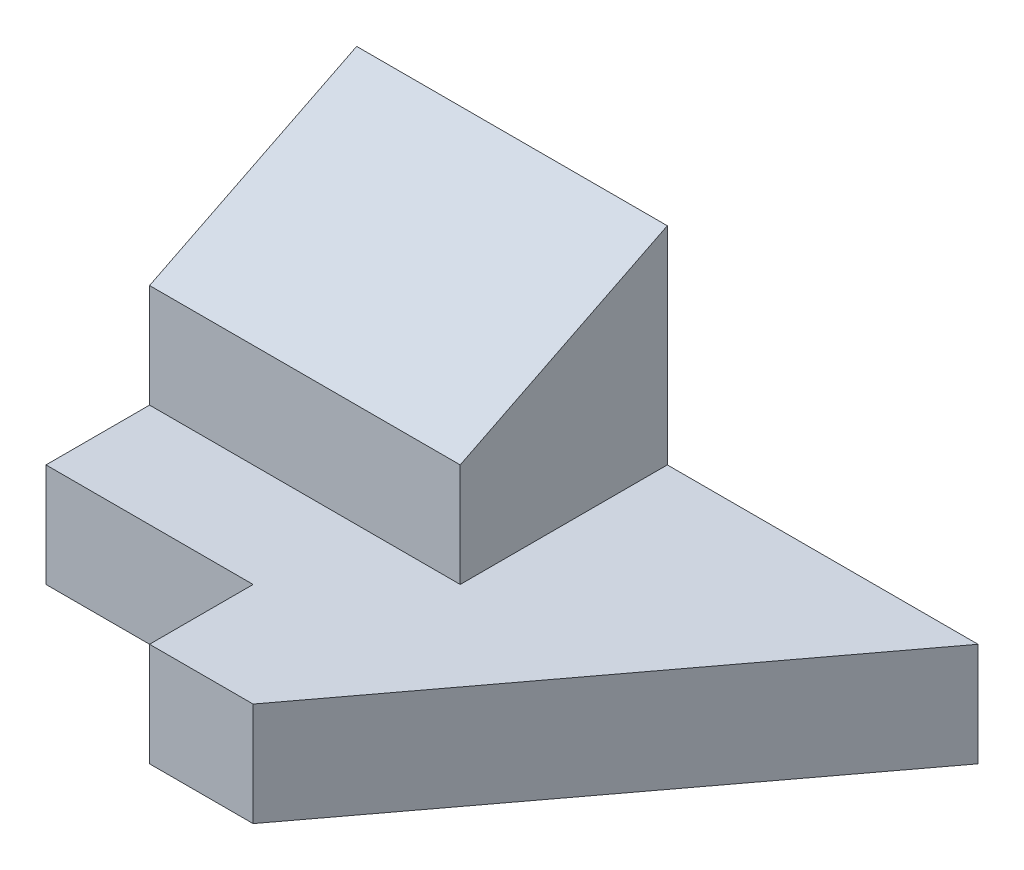
ISO-10303-21;
HEADER;
FILE_DESCRIPTION(('STEP AP214'),'2;1');
FILE_NAME('part.step','',(''),(''),'','','');
FILE_SCHEMA(('AUTOMOTIVE_DESIGN { 1 0 10303 214 1 1 1 1 }'));
ENDSEC;
DATA;
#1=APPLICATION_CONTEXT('core data for automotive mechanical design processes');
#2=APPLICATION_PROTOCOL_DEFINITION('international standard','automotive_design',2000,#1);
#3=PRODUCT_CONTEXT('',#1,'mechanical');
#4=PRODUCT('Part','Part','',(#3));
#5=PRODUCT_RELATED_PRODUCT_CATEGORY('part','',(#4));
#6=PRODUCT_DEFINITION_FORMATION('','',#4);
#7=PRODUCT_DEFINITION_CONTEXT('part definition',#1,'design');
#8=PRODUCT_DEFINITION('design','',#6,#7);
#9=PRODUCT_DEFINITION_SHAPE('','',#8);
#10=(LENGTH_UNIT() NAMED_UNIT(*) SI_UNIT(.MILLI.,.METRE.));
#11=(NAMED_UNIT(*) PLANE_ANGLE_UNIT() SI_UNIT($,.RADIAN.));
#12=(NAMED_UNIT(*) SI_UNIT($,.STERADIAN.) SOLID_ANGLE_UNIT());
#13=UNCERTAINTY_MEASURE_WITH_UNIT(LENGTH_MEASURE(1.E-05),#10,'distance_accuracy_value','');
#14=(GEOMETRIC_REPRESENTATION_CONTEXT(3) GLOBAL_UNCERTAINTY_ASSIGNED_CONTEXT((#13)) GLOBAL_UNIT_ASSIGNED_CONTEXT((#10,
#11,#12)) REPRESENTATION_CONTEXT('',''));
#15=CARTESIAN_POINT('',(0.,0.,0.));
#16=DIRECTION('',(0.,0.,1.));
#17=DIRECTION('',(1.,0.,0.));
#18=AXIS2_PLACEMENT_3D('',#15,#16,#17);
#19=CARTESIAN_POINT('',(0.,10.,0.));
#20=DIRECTION('',(0.,1.,0.));
#21=DIRECTION('',(0.,0.,1.));
#22=AXIS2_PLACEMENT_3D('',#19,#20,#21);
#23=PLANE('',#22);
#24=DIRECTION('',(0.,0.,1.));
#25=VECTOR('',#24,1.);
#26=CARTESIAN_POINT('',(-30.,10.,0.));
#27=LINE('',#26,#25);
#28=CARTESIAN_POINT('',(-30.,10.,0.));
#29=VERTEX_POINT('',#28);
#30=CARTESIAN_POINT('',(-30.,10.,20.));
#31=VERTEX_POINT('',#30);
#32=EDGE_CURVE('E83',#29,#31,#27,.T.);
#33=ORIENTED_EDGE('',*,*,#32,.T.);
#34=DIRECTION('',(-1.,0.,0.));
#35=VECTOR('',#34,1.);
#36=CARTESIAN_POINT('',(0.,10.,20.));
#37=LINE('',#36,#35);
#38=CARTESIAN_POINT('',(-60.,10.,20.));
#39=VERTEX_POINT('',#38);
#40=EDGE_CURVE('E12',#31,#39,#37,.T.);
#41=ORIENTED_EDGE('',*,*,#40,.T.);
#42=DIRECTION('',(0.,0.,1.));
#43=VECTOR('',#42,1.);
#44=CARTESIAN_POINT('',(-60.,10.,0.));
#45=LINE('',#44,#43);
#46=CARTESIAN_POINT('',(-60.,10.,30.));
#47=VERTEX_POINT('',#46);
#48=EDGE_CURVE('E171',#39,#47,#45,.T.);
#49=ORIENTED_EDGE('',*,*,#48,.T.);
#50=DIRECTION('',(1.,0.,0.));
#51=VECTOR('',#50,1.);
#52=CARTESIAN_POINT('',(0.,10.,30.));
#53=LINE('',#52,#51);
#54=CARTESIAN_POINT('',(-40.,10.,30.));
#55=VERTEX_POINT('',#54);
#56=EDGE_CURVE('E173',#47,#55,#53,.T.);
#57=ORIENTED_EDGE('',*,*,#56,.T.);
#58=DIRECTION('',(0.,0.,1.));
#59=VECTOR('',#58,1.);
#60=CARTESIAN_POINT('',(-40.,10.,0.));
#61=LINE('',#60,#59);
#62=CARTESIAN_POINT('',(-40.,10.,40.));
#63=VERTEX_POINT('',#62);
#64=EDGE_CURVE('E176',#55,#63,#61,.T.);
#65=ORIENTED_EDGE('',*,*,#64,.T.);
#66=DIRECTION('',(1.,0.,0.));
#67=VECTOR('',#66,1.);
#68=CARTESIAN_POINT('',(0.,10.,40.));
#69=LINE('',#68,#67);
#70=CARTESIAN_POINT('',(-30.,10.,40.));
#71=VERTEX_POINT('',#70);
#72=EDGE_CURVE('E178',#63,#71,#69,.T.);
#73=ORIENTED_EDGE('',*,*,#72,.T.);
#74=DIRECTION('',(0.6,0.,-0.8));
#75=VECTOR('',#74,1.);
#76=CARTESIAN_POINT('',(0.,10.,0.));
#77=LINE('',#76,#75);
#78=CARTESIAN_POINT('',(0.,10.,0.));
#79=VERTEX_POINT('',#78);
#80=EDGE_CURVE('E180',#71,#79,#77,.T.);
#81=ORIENTED_EDGE('',*,*,#80,.T.);
#82=DIRECTION('',(-1.,0.,0.));
#83=VECTOR('',#82,1.);
#84=CARTESIAN_POINT('',(0.,10.,0.));
#85=LINE('',#84,#83);
#86=EDGE_CURVE('E97',#79,#29,#85,.T.);
#87=ORIENTED_EDGE('',*,*,#86,.T.);
#88=EDGE_LOOP('',(#33,#41,#49,#57,#65,#73,#81,#87));
#89=FACE_BOUND('',#88,.T.);
#90=ADVANCED_FACE('F75',(#89),#23,.T.);
#91=CARTESIAN_POINT('',(0.,0.,0.));
#92=DIRECTION('',(0.,1.,0.));
#93=DIRECTION('',(0.,0.,1.));
#94=AXIS2_PLACEMENT_3D('',#91,#92,#93);
#95=PLANE('',#94);
#96=DIRECTION('',(1.,0.,0.));
#97=VECTOR('',#96,1.);
#98=CARTESIAN_POINT('',(0.,0.,30.));
#99=LINE('',#98,#97);
#100=CARTESIAN_POINT('',(-60.,0.,30.));
#101=VERTEX_POINT('',#100);
#102=CARTESIAN_POINT('',(-40.,0.,30.));
#103=VERTEX_POINT('',#102);
#104=EDGE_CURVE('E185',#101,#103,#99,.T.);
#105=ORIENTED_EDGE('',*,*,#104,.F.);
#106=DIRECTION('',(0.,0.,1.));
#107=VECTOR('',#106,1.);
#108=CARTESIAN_POINT('',(-60.,0.,0.));
#109=LINE('',#108,#107);
#110=CARTESIAN_POINT('',(-60.,0.,0.));
#111=VERTEX_POINT('',#110);
#112=EDGE_CURVE('E165',#111,#101,#109,.T.);
#113=ORIENTED_EDGE('',*,*,#112,.F.);
#114=DIRECTION('',(-1.,0.,0.));
#115=VECTOR('',#114,1.);
#116=CARTESIAN_POINT('',(0.,0.,0.));
#117=LINE('',#116,#115);
#118=CARTESIAN_POINT('',(0.,0.,0.));
#119=VERTEX_POINT('',#118);
#120=EDGE_CURVE('E174',#119,#111,#117,.T.);
#121=ORIENTED_EDGE('',*,*,#120,.F.);
#122=DIRECTION('',(0.6,0.,-0.8));
#123=VECTOR('',#122,1.);
#124=CARTESIAN_POINT('',(0.,0.,0.));
#125=LINE('',#124,#123);
#126=CARTESIAN_POINT('',(-30.,0.,40.));
#127=VERTEX_POINT('',#126);
#128=EDGE_CURVE('E191',#127,#119,#125,.T.);
#129=ORIENTED_EDGE('',*,*,#128,.F.);
#130=DIRECTION('',(1.,0.,0.));
#131=VECTOR('',#130,1.);
#132=CARTESIAN_POINT('',(0.,0.,40.));
#133=LINE('',#132,#131);
#134=CARTESIAN_POINT('',(-40.,0.,40.));
#135=VERTEX_POINT('',#134);
#136=EDGE_CURVE('E189',#135,#127,#133,.T.);
#137=ORIENTED_EDGE('',*,*,#136,.F.);
#138=DIRECTION('',(0.,0.,1.));
#139=VECTOR('',#138,1.);
#140=CARTESIAN_POINT('',(-40.,0.,0.));
#141=LINE('',#140,#139);
#142=EDGE_CURVE('E187',#103,#135,#141,.T.);
#143=ORIENTED_EDGE('',*,*,#142,.F.);
#144=EDGE_LOOP('',(#105,#113,#121,#129,#137,#143));
#145=FACE_BOUND('',#144,.T.);
#146=ADVANCED_FACE('F239',(#145),#95,.F.);
#147=CARTESIAN_POINT('',(-40.,10.,0.));
#148=DIRECTION('',(1.,0.,0.));
#149=DIRECTION('',(0.,0.,-1.));
#150=AXIS2_PLACEMENT_3D('',#147,#148,#149);
#151=PLANE('',#150);
#152=ORIENTED_EDGE('',*,*,#142,.T.);
#153=DIRECTION('',(0.,-1.,0.));
#154=VECTOR('',#153,1.);
#155=CARTESIAN_POINT('',(-40.,10.,40.));
#156=LINE('',#155,#154);
#157=EDGE_CURVE('E199',#63,#135,#156,.T.);
#158=ORIENTED_EDGE('',*,*,#157,.F.);
#159=ORIENTED_EDGE('',*,*,#64,.F.);
#160=DIRECTION('',(0.,-1.,0.));
#161=VECTOR('',#160,1.);
#162=CARTESIAN_POINT('',(-40.,10.,30.));
#163=LINE('',#162,#161);
#164=EDGE_CURVE('E202',#55,#103,#163,.T.);
#165=ORIENTED_EDGE('',*,*,#164,.T.);
#166=EDGE_LOOP('',(#152,#158,#159,#165));
#167=FACE_BOUND('',#166,.T.);
#168=ADVANCED_FACE('F225',(#167),#151,.F.);
#169=CARTESIAN_POINT('',(0.,10.,30.));
#170=DIRECTION('',(0.,0.,-1.));
#171=DIRECTION('',(-1.,0.,0.));
#172=AXIS2_PLACEMENT_3D('',#169,#170,#171);
#173=PLANE('',#172);
#174=ORIENTED_EDGE('',*,*,#104,.T.);
#175=ORIENTED_EDGE('',*,*,#164,.F.);
#176=ORIENTED_EDGE('',*,*,#56,.F.);
#177=DIRECTION('',(0.,-1.,0.));
#178=VECTOR('',#177,1.);
#179=CARTESIAN_POINT('',(-60.,10.,30.));
#180=LINE('',#179,#178);
#181=EDGE_CURVE('E205',#47,#101,#180,.T.);
#182=ORIENTED_EDGE('',*,*,#181,.T.);
#183=EDGE_LOOP('',(#174,#175,#176,#182));
#184=FACE_BOUND('',#183,.T.);
#185=ADVANCED_FACE('F221',(#184),#173,.F.);
#186=CARTESIAN_POINT('',(-60.,10.,0.));
#187=DIRECTION('',(1.,0.,0.));
#188=DIRECTION('',(0.,0.,-1.));
#189=AXIS2_PLACEMENT_3D('',#186,#187,#188);
#190=PLANE('',#189);
#191=DIRECTION('',(0.,-1.,0.));
#192=VECTOR('',#191,1.);
#193=CARTESIAN_POINT('',(-60.,30.,20.));
#194=LINE('',#193,#192);
#195=CARTESIAN_POINT('',(-60.,20.,20.));
#196=VERTEX_POINT('',#195);
#197=EDGE_CURVE('E167',#196,#39,#194,.T.);
#198=ORIENTED_EDGE('',*,*,#197,.F.);
#199=DIRECTION('',(0.,0.447213595499958,-0.894427190999916));
#200=VECTOR('',#199,1.);
#201=CARTESIAN_POINT('',(-60.,26.,8.));
#202=LINE('',#201,#200);
#203=CARTESIAN_POINT('',(-60.,30.,0.));
#204=VERTEX_POINT('',#203);
#205=EDGE_CURVE('E151',#196,#204,#202,.T.);
#206=ORIENTED_EDGE('',*,*,#205,.T.);
#207=DIRECTION('',(0.,-1.,0.));
#208=VECTOR('',#207,1.);
#209=CARTESIAN_POINT('',(-60.,10.,0.));
#210=LINE('',#209,#208);
#211=EDGE_CURVE('E162',#204,#111,#210,.T.);
#212=ORIENTED_EDGE('',*,*,#211,.T.);
#213=ORIENTED_EDGE('',*,*,#112,.T.);
#214=ORIENTED_EDGE('',*,*,#181,.F.);
#215=ORIENTED_EDGE('',*,*,#48,.F.);
#216=EDGE_LOOP('',(#198,#206,#212,#213,#214,#215));
#217=FACE_BOUND('',#216,.T.);
#218=ADVANCED_FACE('F77',(#217),#190,.F.);
#219=CARTESIAN_POINT('',(0.,10.,0.));
#220=DIRECTION('',(0.,0.,1.));
#221=DIRECTION('',(1.,0.,0.));
#222=AXIS2_PLACEMENT_3D('',#219,#220,#221);
#223=PLANE('',#222);
#224=ORIENTED_EDGE('',*,*,#211,.F.);
#225=DIRECTION('',(-1.,0.,0.));
#226=VECTOR('',#225,1.);
#227=CARTESIAN_POINT('',(0.,30.,0.));
#228=LINE('',#227,#226);
#229=CARTESIAN_POINT('',(-30.,30.,0.));
#230=VERTEX_POINT('',#229);
#231=EDGE_CURVE('E210',#230,#204,#228,.T.);
#232=ORIENTED_EDGE('',*,*,#231,.F.);
#233=DIRECTION('',(0.,-1.,0.));
#234=VECTOR('',#233,1.);
#235=CARTESIAN_POINT('',(-30.,30.,0.));
#236=LINE('',#235,#234);
#237=EDGE_CURVE('E157',#230,#29,#236,.T.);
#238=ORIENTED_EDGE('',*,*,#237,.T.);
#239=ORIENTED_EDGE('',*,*,#86,.F.);
#240=DIRECTION('',(0.,-1.,0.));
#241=VECTOR('',#240,1.);
#242=CARTESIAN_POINT('',(0.,10.,0.));
#243=LINE('',#242,#241);
#244=EDGE_CURVE('E183',#79,#119,#243,.T.);
#245=ORIENTED_EDGE('',*,*,#244,.T.);
#246=ORIENTED_EDGE('',*,*,#120,.T.);
#247=EDGE_LOOP('',(#224,#232,#238,#239,#245,#246));
#248=FACE_BOUND('',#247,.T.);
#249=ADVANCED_FACE('F209',(#248),#223,.F.);
#250=CARTESIAN_POINT('',(0.,10.,0.));
#251=DIRECTION('',(-0.8,0.,-0.6));
#252=DIRECTION('',(-0.6,0.,0.8));
#253=AXIS2_PLACEMENT_3D('',#250,#251,#252);
#254=PLANE('',#253);
#255=ORIENTED_EDGE('',*,*,#128,.T.);
#256=ORIENTED_EDGE('',*,*,#244,.F.);
#257=ORIENTED_EDGE('',*,*,#80,.F.);
#258=DIRECTION('',(0.,-1.,0.));
#259=VECTOR('',#258,1.);
#260=CARTESIAN_POINT('',(-30.,10.,40.));
#261=LINE('',#260,#259);
#262=EDGE_CURVE('E196',#71,#127,#261,.T.);
#263=ORIENTED_EDGE('',*,*,#262,.T.);
#264=EDGE_LOOP('',(#255,#256,#257,#263));
#265=FACE_BOUND('',#264,.T.);
#266=ADVANCED_FACE('F234',(#265),#254,.F.);
#267=CARTESIAN_POINT('',(0.,10.,40.));
#268=DIRECTION('',(0.,0.,-1.));
#269=DIRECTION('',(-1.,0.,0.));
#270=AXIS2_PLACEMENT_3D('',#267,#268,#269);
#271=PLANE('',#270);
#272=ORIENTED_EDGE('',*,*,#136,.T.);
#273=ORIENTED_EDGE('',*,*,#262,.F.);
#274=ORIENTED_EDGE('',*,*,#72,.F.);
#275=ORIENTED_EDGE('',*,*,#157,.T.);
#276=EDGE_LOOP('',(#272,#273,#274,#275));
#277=FACE_BOUND('',#276,.T.);
#278=ADVANCED_FACE('F230',(#277),#271,.F.);
#279=CARTESIAN_POINT('',(0.,30.,20.));
#280=DIRECTION('',(0.,0.,-1.));
#281=DIRECTION('',(-1.,0.,0.));
#282=AXIS2_PLACEMENT_3D('',#279,#280,#281);
#283=PLANE('',#282);
#284=DIRECTION('',(0.,-1.,0.));
#285=VECTOR('',#284,1.);
#286=CARTESIAN_POINT('',(-30.,30.,20.));
#287=LINE('',#286,#285);
#288=CARTESIAN_POINT('',(-30.,20.,20.));
#289=VERTEX_POINT('',#288);
#290=EDGE_CURVE('E90',#289,#31,#287,.T.);
#291=ORIENTED_EDGE('',*,*,#290,.F.);
#292=DIRECTION('',(1.,0.,0.));
#293=VECTOR('',#292,1.);
#294=CARTESIAN_POINT('',(-89.,20.,20.));
#295=LINE('',#294,#293);
#296=EDGE_CURVE('E146',#196,#289,#295,.T.);
#297=ORIENTED_EDGE('',*,*,#296,.F.);
#298=ORIENTED_EDGE('',*,*,#197,.T.);
#299=ORIENTED_EDGE('',*,*,#40,.F.);
#300=EDGE_LOOP('',(#291,#297,#298,#299));
#301=FACE_BOUND('',#300,.T.);
#302=ADVANCED_FACE('F161',(#301),#283,.F.);
#303=CARTESIAN_POINT('',(-30.,30.,0.));
#304=DIRECTION('',(-1.,0.,0.));
#305=DIRECTION('',(0.,0.,1.));
#306=AXIS2_PLACEMENT_3D('',#303,#304,#305);
#307=PLANE('',#306);
#308=ORIENTED_EDGE('',*,*,#237,.F.);
#309=DIRECTION('',(0.,0.447213595499958,-0.894427190999916));
#310=VECTOR('',#309,1.);
#311=CARTESIAN_POINT('',(-30.,30.,0.));
#312=LINE('',#311,#310);
#313=EDGE_CURVE('E148',#289,#230,#312,.T.);
#314=ORIENTED_EDGE('',*,*,#313,.F.);
#315=ORIENTED_EDGE('',*,*,#290,.T.);
#316=ORIENTED_EDGE('',*,*,#32,.F.);
#317=EDGE_LOOP('',(#308,#314,#315,#316));
#318=FACE_BOUND('',#317,.T.);
#319=ADVANCED_FACE('F155',(#318),#307,.F.);
#320=CARTESIAN_POINT('',(-89.,30.,0.));
#321=DIRECTION('',(0.,-0.894427190999916,-0.447213595499958));
#322=DIRECTION('',(0.,0.447213595499958,-0.894427190999916));
#323=AXIS2_PLACEMENT_3D('',#320,#321,#322);
#324=PLANE('',#323);
#325=ORIENTED_EDGE('',*,*,#296,.T.);
#326=ORIENTED_EDGE('',*,*,#313,.T.);
#327=ORIENTED_EDGE('',*,*,#231,.T.);
#328=ORIENTED_EDGE('',*,*,#205,.F.);
#329=EDGE_LOOP('',(#325,#326,#327,#328));
#330=FACE_BOUND('',#329,.T.);
#331=ADVANCED_FACE('F147',(#330),#324,.F.);
#332=CLOSED_SHELL('',(#90,#146,#168,#185,#218,#249,#266,#278,#302,#319,#331));
#333=MANIFOLD_SOLID_BREP('B2',#332);
#334=ADVANCED_BREP_SHAPE_REPRESENTATION('',(#18,#333),#14);
#335=SHAPE_DEFINITION_REPRESENTATION(#9,#334);
ENDSEC;
END-ISO-10303-21;
